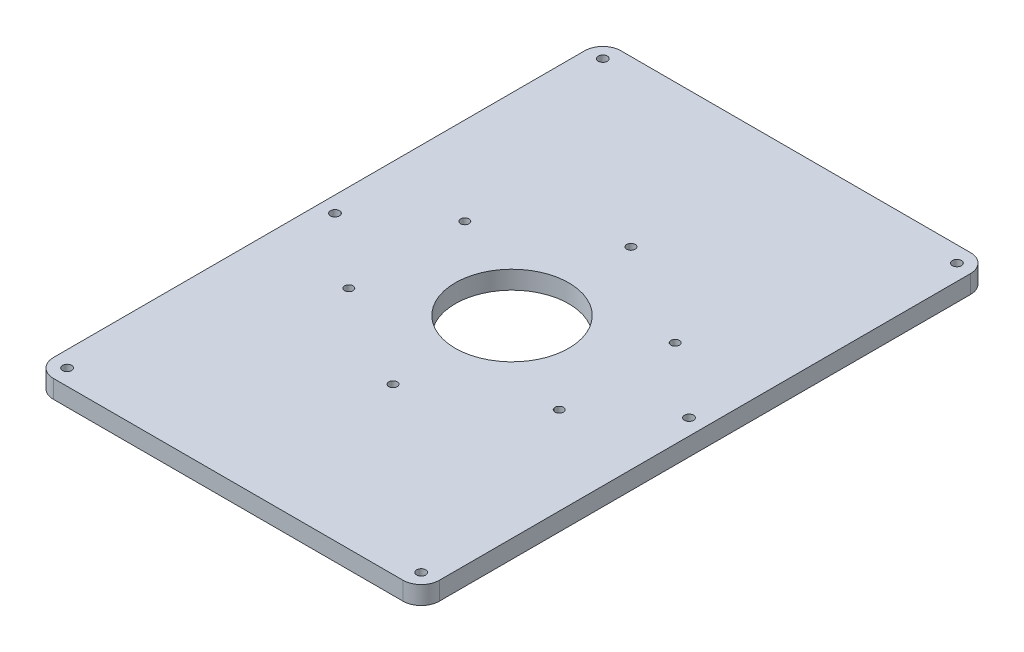
ISO-10303-21;
HEADER;
FILE_DESCRIPTION(('STEP AP214'),'2;1');
FILE_NAME('part.step','',(''),(''),'','','');
FILE_SCHEMA(('AUTOMOTIVE_DESIGN { 1 0 10303 214 1 1 1 1 }'));
ENDSEC;
DATA;
#1=APPLICATION_CONTEXT('core data for automotive mechanical design processes');
#2=APPLICATION_PROTOCOL_DEFINITION('international standard','automotive_design',2000,#1);
#3=PRODUCT_CONTEXT('',#1,'mechanical');
#4=PRODUCT('Part','Part','',(#3));
#5=PRODUCT_RELATED_PRODUCT_CATEGORY('part','',(#4));
#6=PRODUCT_DEFINITION_FORMATION('','',#4);
#7=PRODUCT_DEFINITION_CONTEXT('part definition',#1,'design');
#8=PRODUCT_DEFINITION('design','',#6,#7);
#9=PRODUCT_DEFINITION_SHAPE('','',#8);
#10=(LENGTH_UNIT() NAMED_UNIT(*) SI_UNIT(.MILLI.,.METRE.));
#11=(NAMED_UNIT(*) PLANE_ANGLE_UNIT() SI_UNIT($,.RADIAN.));
#12=(NAMED_UNIT(*) SI_UNIT($,.STERADIAN.) SOLID_ANGLE_UNIT());
#13=UNCERTAINTY_MEASURE_WITH_UNIT(LENGTH_MEASURE(1.E-05),#10,'distance_accuracy_value','');
#14=(GEOMETRIC_REPRESENTATION_CONTEXT(3) GLOBAL_UNCERTAINTY_ASSIGNED_CONTEXT((#13)) GLOBAL_UNIT_ASSIGNED_CONTEXT((#10,
#11,#12)) REPRESENTATION_CONTEXT('',''));
#15=CARTESIAN_POINT('',(0.,0.,0.));
#16=DIRECTION('',(0.,0.,1.));
#17=DIRECTION('',(1.,0.,0.));
#18=AXIS2_PLACEMENT_3D('',#15,#16,#17);
#19=CARTESIAN_POINT('',(84.9999999999999,8.,-125.));
#20=DIRECTION('',(-1.,0.,0.));
#21=DIRECTION('',(0.,0.,1.));
#22=AXIS2_PLACEMENT_3D('',#19,#20,#21);
#23=PLANE('',#22);
#24=DIRECTION('',(0.,0.,-1.));
#25=VECTOR('',#24,1.);
#26=CARTESIAN_POINT('',(84.9999999999999,8.,-125.));
#27=LINE('',#26,#25);
#28=CARTESIAN_POINT('',(85.,8.,117.));
#29=VERTEX_POINT('',#28);
#30=CARTESIAN_POINT('',(84.9999999999999,8.,-117.));
#31=VERTEX_POINT('',#30);
#32=EDGE_CURVE('E124',#29,#31,#27,.T.);
#33=ORIENTED_EDGE('',*,*,#32,.F.);
#34=DIRECTION('',(0.,-1.,0.));
#35=VECTOR('',#34,1.);
#36=CARTESIAN_POINT('',(85.,8.,117.));
#37=LINE('',#36,#35);
#38=CARTESIAN_POINT('',(85.,0.,117.));
#39=VERTEX_POINT('',#38);
#40=EDGE_CURVE('E109',#29,#39,#37,.T.);
#41=ORIENTED_EDGE('',*,*,#40,.T.);
#42=DIRECTION('',(0.,0.,-1.));
#43=VECTOR('',#42,1.);
#44=CARTESIAN_POINT('',(84.9999999999999,0.,-125.));
#45=LINE('',#44,#43);
#46=CARTESIAN_POINT('',(84.9999999999999,0.,-117.));
#47=VERTEX_POINT('',#46);
#48=EDGE_CURVE('E121',#39,#47,#45,.T.);
#49=ORIENTED_EDGE('',*,*,#48,.T.);
#50=DIRECTION('',(0.,-1.,0.));
#51=VECTOR('',#50,1.);
#52=CARTESIAN_POINT('',(84.9999999999999,8.,-117.));
#53=LINE('',#52,#51);
#54=EDGE_CURVE('E126',#47,#31,#53,.F.);
#55=ORIENTED_EDGE('',*,*,#54,.T.);
#56=EDGE_LOOP('',(#33,#41,#49,#55));
#57=FACE_BOUND('',#56,.T.);
#58=ADVANCED_FACE('F36',(#57),#23,.F.);
#59=CARTESIAN_POINT('',(-85.0000000000001,8.,-125.));
#60=DIRECTION('',(0.,0.,1.));
#61=DIRECTION('',(1.,0.,0.));
#62=AXIS2_PLACEMENT_3D('',#59,#60,#61);
#63=PLANE('',#62);
#64=DIRECTION('',(-1.,0.,0.));
#65=VECTOR('',#64,1.);
#66=CARTESIAN_POINT('',(-85.0000000000001,8.,-125.));
#67=LINE('',#66,#65);
#68=CARTESIAN_POINT('',(76.9999999999999,8.,-125.));
#69=VERTEX_POINT('',#68);
#70=CARTESIAN_POINT('',(-77.0000000000001,8.,-125.));
#71=VERTEX_POINT('',#70);
#72=EDGE_CURVE('E225',#69,#71,#67,.T.);
#73=ORIENTED_EDGE('',*,*,#72,.F.);
#74=DIRECTION('',(0.,-1.,0.));
#75=VECTOR('',#74,1.);
#76=CARTESIAN_POINT('',(76.9999999999999,8.,-125.));
#77=LINE('',#76,#75);
#78=CARTESIAN_POINT('',(76.9999999999999,0.,-125.));
#79=VERTEX_POINT('',#78);
#80=EDGE_CURVE('E11',#69,#79,#77,.T.);
#81=ORIENTED_EDGE('',*,*,#80,.T.);
#82=DIRECTION('',(-1.,0.,0.));
#83=VECTOR('',#82,1.);
#84=CARTESIAN_POINT('',(-85.0000000000001,0.,-125.));
#85=LINE('',#84,#83);
#86=CARTESIAN_POINT('',(-77.0000000000001,0.,-125.));
#87=VERTEX_POINT('',#86);
#88=EDGE_CURVE('E131',#79,#87,#85,.T.);
#89=ORIENTED_EDGE('',*,*,#88,.T.);
#90=DIRECTION('',(0.,-1.,0.));
#91=VECTOR('',#90,1.);
#92=CARTESIAN_POINT('',(-77.0000000000001,8.,-125.));
#93=LINE('',#92,#91);
#94=EDGE_CURVE('E45',#87,#71,#93,.F.);
#95=ORIENTED_EDGE('',*,*,#94,.T.);
#96=EDGE_LOOP('',(#73,#81,#89,#95));
#97=FACE_BOUND('',#96,.T.);
#98=ADVANCED_FACE('F243',(#97),#63,.F.);
#99=CARTESIAN_POINT('',(-85.0000000000001,8.,-125.));
#100=DIRECTION('',(1.,0.,0.));
#101=DIRECTION('',(0.,0.,-1.));
#102=AXIS2_PLACEMENT_3D('',#99,#100,#101);
#103=PLANE('',#102);
#104=DIRECTION('',(0.,0.,1.));
#105=VECTOR('',#104,1.);
#106=CARTESIAN_POINT('',(-85.0000000000001,0.,-125.));
#107=LINE('',#106,#105);
#108=CARTESIAN_POINT('',(-85.0000000000001,0.,-117.));
#109=VERTEX_POINT('',#108);
#110=CARTESIAN_POINT('',(-85.,0.,117.));
#111=VERTEX_POINT('',#110);
#112=EDGE_CURVE('E135',#109,#111,#107,.T.);
#113=ORIENTED_EDGE('',*,*,#112,.T.);
#114=DIRECTION('',(0.,-1.,0.));
#115=VECTOR('',#114,1.);
#116=CARTESIAN_POINT('',(-85.,8.,117.));
#117=LINE('',#116,#115);
#118=CARTESIAN_POINT('',(-85.,8.,117.));
#119=VERTEX_POINT('',#118);
#120=EDGE_CURVE('E53',#111,#119,#117,.F.);
#121=ORIENTED_EDGE('',*,*,#120,.T.);
#122=DIRECTION('',(0.,0.,1.));
#123=VECTOR('',#122,1.);
#124=CARTESIAN_POINT('',(-85.0000000000001,8.,-125.));
#125=LINE('',#124,#123);
#126=CARTESIAN_POINT('',(-85.0000000000001,8.,-117.));
#127=VERTEX_POINT('',#126);
#128=EDGE_CURVE('E226',#127,#119,#125,.T.);
#129=ORIENTED_EDGE('',*,*,#128,.F.);
#130=DIRECTION('',(0.,-1.,0.));
#131=VECTOR('',#130,1.);
#132=CARTESIAN_POINT('',(-85.0000000000001,8.,-117.));
#133=LINE('',#132,#131);
#134=EDGE_CURVE('E161',#127,#109,#133,.T.);
#135=ORIENTED_EDGE('',*,*,#134,.T.);
#136=EDGE_LOOP('',(#113,#121,#129,#135));
#137=FACE_BOUND('',#136,.T.);
#138=ADVANCED_FACE('F237',(#137),#103,.F.);
#139=CARTESIAN_POINT('',(-85.,8.,125.));
#140=DIRECTION('',(0.,0.,-1.));
#141=DIRECTION('',(-1.,0.,0.));
#142=AXIS2_PLACEMENT_3D('',#139,#140,#141);
#143=PLANE('',#142);
#144=DIRECTION('',(1.,0.,0.));
#145=VECTOR('',#144,1.);
#146=CARTESIAN_POINT('',(-85.,0.,125.));
#147=LINE('',#146,#145);
#148=CARTESIAN_POINT('',(-77.,0.,125.));
#149=VERTEX_POINT('',#148);
#150=CARTESIAN_POINT('',(77.,0.,125.));
#151=VERTEX_POINT('',#150);
#152=EDGE_CURVE('E145',#149,#151,#147,.T.);
#153=ORIENTED_EDGE('',*,*,#152,.T.);
#154=DIRECTION('',(0.,-1.,0.));
#155=VECTOR('',#154,1.);
#156=CARTESIAN_POINT('',(77.,8.,125.));
#157=LINE('',#156,#155);
#158=CARTESIAN_POINT('',(77.,8.,125.));
#159=VERTEX_POINT('',#158);
#160=EDGE_CURVE('E110',#151,#159,#157,.F.);
#161=ORIENTED_EDGE('',*,*,#160,.T.);
#162=DIRECTION('',(1.,0.,0.));
#163=VECTOR('',#162,1.);
#164=CARTESIAN_POINT('',(-85.,8.,125.));
#165=LINE('',#164,#163);
#166=CARTESIAN_POINT('',(-77.,8.,125.));
#167=VERTEX_POINT('',#166);
#168=EDGE_CURVE('E141',#167,#159,#165,.T.);
#169=ORIENTED_EDGE('',*,*,#168,.F.);
#170=DIRECTION('',(0.,-1.,0.));
#171=VECTOR('',#170,1.);
#172=CARTESIAN_POINT('',(-77.,8.,125.));
#173=LINE('',#172,#171);
#174=EDGE_CURVE('E115',#167,#149,#173,.T.);
#175=ORIENTED_EDGE('',*,*,#174,.T.);
#176=EDGE_LOOP('',(#153,#161,#169,#175));
#177=FACE_BOUND('',#176,.T.);
#178=ADVANCED_FACE('F233',(#177),#143,.F.);
#179=CARTESIAN_POINT('',(0.,8.,0.));
#180=DIRECTION('',(0.,1.,0.));
#181=DIRECTION('',(0.,0.,1.));
#182=AXIS2_PLACEMENT_3D('',#179,#180,#181);
#183=PLANE('',#182);
#184=CARTESIAN_POINT('',(46.3437274799606,8.,25.5405604649214));
#185=DIRECTION('',(0.,1.,0.));
#186=DIRECTION('',(0.,0.,1.));
#187=AXIS2_PLACEMENT_3D('',#184,#185,#186);
#188=CIRCLE('',#187,1.86601650584626);
#189=CARTESIAN_POINT('',(46.3437274799606,8.,27.4065769707677));
#190=VERTEX_POINT('',#189);
#191=EDGE_CURVE('E507',#190,#190,#188,.T.);
#192=ORIENTED_EDGE('',*,*,#191,.F.);
#193=EDGE_LOOP('',(#192));
#194=FACE_BOUND('',#193,.T.);
#195=CARTESIAN_POINT('',(46.3437274799606,8.,-25.5405604649214));
#196=DIRECTION('',(0.,1.,0.));
#197=DIRECTION('',(0.,0.,-1.));
#198=AXIS2_PLACEMENT_3D('',#195,#196,#197);
#199=CIRCLE('',#198,1.86601650584626);
#200=CARTESIAN_POINT('',(46.3437274799606,8.,-27.4065769707677));
#201=VERTEX_POINT('',#200);
#202=EDGE_CURVE('E508',#201,#201,#199,.T.);
#203=ORIENTED_EDGE('',*,*,#202,.F.);
#204=EDGE_LOOP('',(#203));
#205=FACE_BOUND('',#204,.T.);
#206=CARTESIAN_POINT('',(-46.3437274799606,8.,25.5405604649214));
#207=DIRECTION('',(0.,1.,0.));
#208=DIRECTION('',(0.,0.,-1.));
#209=AXIS2_PLACEMENT_3D('',#206,#207,#208);
#210=CIRCLE('',#209,1.86601650584626);
#211=CARTESIAN_POINT('',(-46.3437274799606,8.,23.6745439590752));
#212=VERTEX_POINT('',#211);
#213=EDGE_CURVE('E511',#212,#212,#210,.T.);
#214=ORIENTED_EDGE('',*,*,#213,.F.);
#215=EDGE_LOOP('',(#214));
#216=FACE_BOUND('',#215,.T.);
#217=CARTESIAN_POINT('',(0.,8.,52.4128369823515));
#218=DIRECTION('',(0.,1.,0.));
#219=DIRECTION('',(0.,0.,-1.));
#220=AXIS2_PLACEMENT_3D('',#217,#218,#219);
#221=CIRCLE('',#220,1.86601650584626);
#222=CARTESIAN_POINT('',(0.,8.,50.5468204765052));
#223=VERTEX_POINT('',#222);
#224=EDGE_CURVE('E522',#223,#223,#221,.T.);
#225=ORIENTED_EDGE('',*,*,#224,.F.);
#226=EDGE_LOOP('',(#225));
#227=FACE_BOUND('',#226,.T.);
#228=CARTESIAN_POINT('',(-46.3437274799606,8.,-25.5405604649214));
#229=DIRECTION('',(0.,1.,0.));
#230=DIRECTION('',(0.,0.,1.));
#231=AXIS2_PLACEMENT_3D('',#228,#229,#230);
#232=CIRCLE('',#231,1.86601650584626);
#233=CARTESIAN_POINT('',(-46.3437274799606,8.,-23.6745439590752));
#234=VERTEX_POINT('',#233);
#235=EDGE_CURVE('E518',#234,#234,#232,.T.);
#236=ORIENTED_EDGE('',*,*,#235,.F.);
#237=EDGE_LOOP('',(#236));
#238=FACE_BOUND('',#237,.T.);
#239=CARTESIAN_POINT('',(0.,8.,-52.4128369823515));
#240=DIRECTION('',(0.,1.,0.));
#241=DIRECTION('',(0.,0.,1.));
#242=AXIS2_PLACEMENT_3D('',#239,#240,#241);
#243=CIRCLE('',#242,1.86601650584626);
#244=CARTESIAN_POINT('',(0.,8.,-50.5468204765052));
#245=VERTEX_POINT('',#244);
#246=EDGE_CURVE('E515',#245,#245,#243,.T.);
#247=ORIENTED_EDGE('',*,*,#246,.F.);
#248=EDGE_LOOP('',(#247));
#249=FACE_BOUND('',#248,.T.);
#250=CARTESIAN_POINT('',(0.,8.,0.));
#251=DIRECTION('',(0.,1.,0.));
#252=DIRECTION('',(0.,0.,1.));
#253=AXIS2_PLACEMENT_3D('',#250,#251,#252);
#254=CIRCLE('',#253,25.);
#255=CARTESIAN_POINT('',(0.,8.,25.));
#256=VERTEX_POINT('',#255);
#257=EDGE_CURVE('E170',#256,#256,#254,.T.);
#258=ORIENTED_EDGE('',*,*,#257,.F.);
#259=EDGE_LOOP('',(#258));
#260=FACE_BOUND('',#259,.T.);
#261=CARTESIAN_POINT('',(77.9999999999992,8.,-118.000000000001));
#262=DIRECTION('',(0.,1.,0.));
#263=DIRECTION('',(0.,0.,-1.));
#264=AXIS2_PLACEMENT_3D('',#261,#262,#263);
#265=CIRCLE('',#264,2.00000000000001);
#266=CARTESIAN_POINT('',(77.9999999999992,8.,-120.000000000001));
#267=VERTEX_POINT('',#266);
#268=EDGE_CURVE('E199',#267,#267,#265,.T.);
#269=ORIENTED_EDGE('',*,*,#268,.F.);
#270=EDGE_LOOP('',(#269));
#271=FACE_BOUND('',#270,.T.);
#272=CARTESIAN_POINT('',(77.9999999999992,8.,118.000000000001));
#273=DIRECTION('',(0.,1.,0.));
#274=DIRECTION('',(0.,0.,1.));
#275=AXIS2_PLACEMENT_3D('',#272,#273,#274);
#276=CIRCLE('',#275,2.00000000000001);
#277=CARTESIAN_POINT('',(77.9999999999992,8.,120.000000000001));
#278=VERTEX_POINT('',#277);
#279=EDGE_CURVE('E205',#278,#278,#276,.T.);
#280=ORIENTED_EDGE('',*,*,#279,.F.);
#281=EDGE_LOOP('',(#280));
#282=FACE_BOUND('',#281,.T.);
#283=CARTESIAN_POINT('',(-78.0000000000001,8.,118.));
#284=DIRECTION('',(0.,1.,0.));
#285=DIRECTION('',(0.,0.,-1.));
#286=AXIS2_PLACEMENT_3D('',#283,#284,#285);
#287=CIRCLE('',#286,2.);
#288=CARTESIAN_POINT('',(-78.0000000000001,8.,116.));
#289=VERTEX_POINT('',#288);
#290=EDGE_CURVE('E211',#289,#289,#287,.T.);
#291=ORIENTED_EDGE('',*,*,#290,.F.);
#292=EDGE_LOOP('',(#291));
#293=FACE_BOUND('',#292,.T.);
#294=CARTESIAN_POINT('',(-78.0000000000004,8.,0.));
#295=DIRECTION('',(0.,1.,0.));
#296=DIRECTION('',(0.,0.,1.));
#297=AXIS2_PLACEMENT_3D('',#294,#295,#296);
#298=CIRCLE('',#297,2.);
#299=CARTESIAN_POINT('',(-78.0000000000004,8.,2.));
#300=VERTEX_POINT('',#299);
#301=EDGE_CURVE('E217',#300,#300,#298,.T.);
#302=ORIENTED_EDGE('',*,*,#301,.F.);
#303=EDGE_LOOP('',(#302));
#304=FACE_BOUND('',#303,.T.);
#305=CARTESIAN_POINT('',(78.0000000000004,8.,-5.41233724504764E-13));
#306=DIRECTION('',(0.,1.,0.));
#307=DIRECTION('',(0.,0.,-1.));
#308=AXIS2_PLACEMENT_3D('',#305,#306,#307);
#309=CIRCLE('',#308,1.99999999999999);
#310=CARTESIAN_POINT('',(78.0000000000004,8.,-2.00000000000053));
#311=VERTEX_POINT('',#310);
#312=EDGE_CURVE('E190',#311,#311,#309,.T.);
#313=ORIENTED_EDGE('',*,*,#312,.F.);
#314=EDGE_LOOP('',(#313));
#315=FACE_BOUND('',#314,.T.);
#316=CARTESIAN_POINT('',(-78.0000000000001,8.,-118.));
#317=DIRECTION('',(0.,1.,0.));
#318=DIRECTION('',(0.,0.,1.));
#319=AXIS2_PLACEMENT_3D('',#316,#317,#318);
#320=CIRCLE('',#319,2.);
#321=CARTESIAN_POINT('',(-78.0000000000001,8.,-116.));
#322=VERTEX_POINT('',#321);
#323=EDGE_CURVE('E138',#322,#322,#320,.T.);
#324=ORIENTED_EDGE('',*,*,#323,.F.);
#325=EDGE_LOOP('',(#324));
#326=FACE_BOUND('',#325,.T.);
#327=ORIENTED_EDGE('',*,*,#168,.T.);
#328=CARTESIAN_POINT('',(77.,8.,117.));
#329=DIRECTION('',(0.,1.,0.));
#330=DIRECTION('',(0.,0.,1.));
#331=AXIS2_PLACEMENT_3D('',#328,#329,#330);
#332=CIRCLE('',#331,8.);
#333=EDGE_CURVE('E159',#159,#29,#332,.T.);
#334=ORIENTED_EDGE('',*,*,#333,.T.);
#335=ORIENTED_EDGE('',*,*,#32,.T.);
#336=CARTESIAN_POINT('',(76.9999999999999,8.,-117.));
#337=DIRECTION('',(0.,1.,0.));
#338=DIRECTION('',(0.,0.,1.));
#339=AXIS2_PLACEMENT_3D('',#336,#337,#338);
#340=CIRCLE('',#339,8.);
#341=EDGE_CURVE('E155',#31,#69,#340,.T.);
#342=ORIENTED_EDGE('',*,*,#341,.T.);
#343=ORIENTED_EDGE('',*,*,#72,.T.);
#344=CARTESIAN_POINT('',(-77.0000000000001,8.,-117.));
#345=DIRECTION('',(0.,1.,0.));
#346=DIRECTION('',(0.,0.,1.));
#347=AXIS2_PLACEMENT_3D('',#344,#345,#346);
#348=CIRCLE('',#347,8.);
#349=EDGE_CURVE('E60',#71,#127,#348,.T.);
#350=ORIENTED_EDGE('',*,*,#349,.T.);
#351=ORIENTED_EDGE('',*,*,#128,.T.);
#352=CARTESIAN_POINT('',(-77.,8.,117.));
#353=DIRECTION('',(0.,1.,0.));
#354=DIRECTION('',(0.,0.,1.));
#355=AXIS2_PLACEMENT_3D('',#352,#353,#354);
#356=CIRCLE('',#355,8.);
#357=EDGE_CURVE('E157',#119,#167,#356,.T.);
#358=ORIENTED_EDGE('',*,*,#357,.T.);
#359=EDGE_LOOP('',(#327,#334,#335,#342,#343,#350,#351,#358));
#360=FACE_BOUND('',#359,.T.);
#361=ADVANCED_FACE('F230',(#194,#205,#216,#227,#238,#249,#260,#271,#282,#293,#304,#315,#326,
#360),#183,.T.);
#362=CARTESIAN_POINT('',(0.,0.,0.));
#363=DIRECTION('',(0.,1.,0.));
#364=DIRECTION('',(0.,0.,1.));
#365=AXIS2_PLACEMENT_3D('',#362,#363,#364);
#366=PLANE('',#365);
#367=CARTESIAN_POINT('',(46.3437274799606,0.,25.5405604649214));
#368=DIRECTION('',(0.,1.,0.));
#369=DIRECTION('',(0.,0.,1.));
#370=AXIS2_PLACEMENT_3D('',#367,#368,#369);
#371=CIRCLE('',#370,1.86601650584626);
#372=CARTESIAN_POINT('',(46.3437274799606,0.,27.4065769707677));
#373=VERTEX_POINT('',#372);
#374=EDGE_CURVE('E40',#373,#373,#371,.T.);
#375=ORIENTED_EDGE('',*,*,#374,.T.);
#376=EDGE_LOOP('',(#375));
#377=FACE_BOUND('',#376,.T.);
#378=CARTESIAN_POINT('',(46.3437274799606,0.,-25.5405604649214));
#379=DIRECTION('',(0.,1.,0.));
#380=DIRECTION('',(0.,0.,1.));
#381=AXIS2_PLACEMENT_3D('',#378,#379,#380);
#382=CIRCLE('',#381,1.86601650584626);
#383=CARTESIAN_POINT('',(46.3437274799606,0.,-23.6745439590752));
#384=VERTEX_POINT('',#383);
#385=EDGE_CURVE('E181',#384,#384,#382,.T.);
#386=ORIENTED_EDGE('',*,*,#385,.T.);
#387=EDGE_LOOP('',(#386));
#388=FACE_BOUND('',#387,.T.);
#389=CARTESIAN_POINT('',(-46.3437274799606,0.,25.5405604649214));
#390=DIRECTION('',(0.,1.,0.));
#391=DIRECTION('',(0.,0.,1.));
#392=AXIS2_PLACEMENT_3D('',#389,#390,#391);
#393=CIRCLE('',#392,1.86601650584626);
#394=CARTESIAN_POINT('',(-46.3437274799606,0.,27.4065769707677));
#395=VERTEX_POINT('',#394);
#396=EDGE_CURVE('E179',#395,#395,#393,.T.);
#397=ORIENTED_EDGE('',*,*,#396,.T.);
#398=EDGE_LOOP('',(#397));
#399=FACE_BOUND('',#398,.T.);
#400=CARTESIAN_POINT('',(0.,0.,52.4128369823515));
#401=DIRECTION('',(0.,1.,0.));
#402=DIRECTION('',(0.,0.,1.));
#403=AXIS2_PLACEMENT_3D('',#400,#401,#402);
#404=CIRCLE('',#403,1.86601650584626);
#405=CARTESIAN_POINT('',(0.,0.,54.2788534881978));
#406=VERTEX_POINT('',#405);
#407=EDGE_CURVE('E176',#406,#406,#404,.T.);
#408=ORIENTED_EDGE('',*,*,#407,.T.);
#409=EDGE_LOOP('',(#408));
#410=FACE_BOUND('',#409,.T.);
#411=CARTESIAN_POINT('',(-46.3437274799606,0.,-25.5405604649214));
#412=DIRECTION('',(0.,1.,0.));
#413=DIRECTION('',(0.,0.,1.));
#414=AXIS2_PLACEMENT_3D('',#411,#412,#413);
#415=CIRCLE('',#414,1.86601650584626);
#416=CARTESIAN_POINT('',(-46.3437274799606,0.,-23.6745439590752));
#417=VERTEX_POINT('',#416);
#418=EDGE_CURVE('E173',#417,#417,#415,.T.);
#419=ORIENTED_EDGE('',*,*,#418,.T.);
#420=EDGE_LOOP('',(#419));
#421=FACE_BOUND('',#420,.T.);
#422=CARTESIAN_POINT('',(0.,0.,-52.4128369823515));
#423=DIRECTION('',(0.,1.,0.));
#424=DIRECTION('',(0.,0.,1.));
#425=AXIS2_PLACEMENT_3D('',#422,#423,#424);
#426=CIRCLE('',#425,1.86601650584626);
#427=CARTESIAN_POINT('',(0.,0.,-50.5468204765052));
#428=VERTEX_POINT('',#427);
#429=EDGE_CURVE('E169',#428,#428,#426,.T.);
#430=ORIENTED_EDGE('',*,*,#429,.T.);
#431=EDGE_LOOP('',(#430));
#432=FACE_BOUND('',#431,.T.);
#433=CARTESIAN_POINT('',(0.,0.,0.));
#434=DIRECTION('',(0.,1.,0.));
#435=DIRECTION('',(0.,0.,1.));
#436=AXIS2_PLACEMENT_3D('',#433,#434,#435);
#437=CIRCLE('',#436,25.);
#438=CARTESIAN_POINT('',(0.,0.,25.));
#439=VERTEX_POINT('',#438);
#440=EDGE_CURVE('E166',#439,#439,#437,.T.);
#441=ORIENTED_EDGE('',*,*,#440,.T.);
#442=EDGE_LOOP('',(#441));
#443=FACE_BOUND('',#442,.T.);
#444=CARTESIAN_POINT('',(77.9999999999992,0.,-118.000000000001));
#445=DIRECTION('',(0.,1.,0.));
#446=DIRECTION('',(0.,0.,-1.));
#447=AXIS2_PLACEMENT_3D('',#444,#445,#446);
#448=CIRCLE('',#447,2.00000000000001);
#449=CARTESIAN_POINT('',(77.9999999999992,0.,-120.000000000001));
#450=VERTEX_POINT('',#449);
#451=EDGE_CURVE('E202',#450,#450,#448,.T.);
#452=ORIENTED_EDGE('',*,*,#451,.T.);
#453=EDGE_LOOP('',(#452));
#454=FACE_BOUND('',#453,.T.);
#455=CARTESIAN_POINT('',(77.9999999999992,0.,118.000000000001));
#456=DIRECTION('',(0.,1.,0.));
#457=DIRECTION('',(0.,0.,1.));
#458=AXIS2_PLACEMENT_3D('',#455,#456,#457);
#459=CIRCLE('',#458,2.00000000000001);
#460=CARTESIAN_POINT('',(77.9999999999992,0.,120.000000000001));
#461=VERTEX_POINT('',#460);
#462=EDGE_CURVE('E208',#461,#461,#459,.T.);
#463=ORIENTED_EDGE('',*,*,#462,.T.);
#464=EDGE_LOOP('',(#463));
#465=FACE_BOUND('',#464,.T.);
#466=CARTESIAN_POINT('',(-78.0000000000001,0.,118.));
#467=DIRECTION('',(0.,1.,0.));
#468=DIRECTION('',(0.,0.,-1.));
#469=AXIS2_PLACEMENT_3D('',#466,#467,#468);
#470=CIRCLE('',#469,2.);
#471=CARTESIAN_POINT('',(-78.0000000000001,0.,116.));
#472=VERTEX_POINT('',#471);
#473=EDGE_CURVE('E214',#472,#472,#470,.T.);
#474=ORIENTED_EDGE('',*,*,#473,.T.);
#475=EDGE_LOOP('',(#474));
#476=FACE_BOUND('',#475,.T.);
#477=CARTESIAN_POINT('',(-78.0000000000004,0.,0.));
#478=DIRECTION('',(0.,1.,0.));
#479=DIRECTION('',(0.,0.,1.));
#480=AXIS2_PLACEMENT_3D('',#477,#478,#479);
#481=CIRCLE('',#480,2.);
#482=CARTESIAN_POINT('',(-78.0000000000004,0.,2.));
#483=VERTEX_POINT('',#482);
#484=EDGE_CURVE('E195',#483,#483,#481,.T.);
#485=ORIENTED_EDGE('',*,*,#484,.T.);
#486=EDGE_LOOP('',(#485));
#487=FACE_BOUND('',#486,.T.);
#488=CARTESIAN_POINT('',(78.0000000000004,0.,-5.41233724504764E-13));
#489=DIRECTION('',(0.,1.,0.));
#490=DIRECTION('',(0.,0.,-1.));
#491=AXIS2_PLACEMENT_3D('',#488,#489,#490);
#492=CIRCLE('',#491,1.99999999999999);
#493=CARTESIAN_POINT('',(78.0000000000004,0.,-2.00000000000053));
#494=VERTEX_POINT('',#493);
#495=EDGE_CURVE('E186',#494,#494,#492,.T.);
#496=ORIENTED_EDGE('',*,*,#495,.T.);
#497=EDGE_LOOP('',(#496));
#498=FACE_BOUND('',#497,.T.);
#499=CARTESIAN_POINT('',(-78.0000000000001,0.,-118.));
#500=DIRECTION('',(0.,1.,0.));
#501=DIRECTION('',(0.,0.,1.));
#502=AXIS2_PLACEMENT_3D('',#499,#500,#501);
#503=CIRCLE('',#502,2.);
#504=CARTESIAN_POINT('',(-78.0000000000001,0.,-116.));
#505=VERTEX_POINT('',#504);
#506=EDGE_CURVE('E132',#505,#505,#503,.T.);
#507=ORIENTED_EDGE('',*,*,#506,.T.);
#508=EDGE_LOOP('',(#507));
#509=FACE_BOUND('',#508,.T.);
#510=ORIENTED_EDGE('',*,*,#48,.F.);
#511=CARTESIAN_POINT('',(77.,0.,117.));
#512=DIRECTION('',(0.,1.,0.));
#513=DIRECTION('',(0.,0.,1.));
#514=AXIS2_PLACEMENT_3D('',#511,#512,#513);
#515=CIRCLE('',#514,8.);
#516=EDGE_CURVE('E105',#39,#151,#515,.F.);
#517=ORIENTED_EDGE('',*,*,#516,.T.);
#518=ORIENTED_EDGE('',*,*,#152,.F.);
#519=CARTESIAN_POINT('',(-77.,0.,117.));
#520=DIRECTION('',(0.,1.,0.));
#521=DIRECTION('',(0.,0.,1.));
#522=AXIS2_PLACEMENT_3D('',#519,#520,#521);
#523=CIRCLE('',#522,8.);
#524=EDGE_CURVE('E116',#149,#111,#523,.F.);
#525=ORIENTED_EDGE('',*,*,#524,.T.);
#526=ORIENTED_EDGE('',*,*,#112,.F.);
#527=CARTESIAN_POINT('',(-77.0000000000001,0.,-117.));
#528=DIRECTION('',(0.,1.,0.));
#529=DIRECTION('',(0.,0.,1.));
#530=AXIS2_PLACEMENT_3D('',#527,#528,#529);
#531=CIRCLE('',#530,8.);
#532=EDGE_CURVE('E125',#109,#87,#531,.F.);
#533=ORIENTED_EDGE('',*,*,#532,.T.);
#534=ORIENTED_EDGE('',*,*,#88,.F.);
#535=CARTESIAN_POINT('',(76.9999999999999,0.,-117.));
#536=DIRECTION('',(0.,1.,0.));
#537=DIRECTION('',(0.,0.,1.));
#538=AXIS2_PLACEMENT_3D('',#535,#536,#537);
#539=CIRCLE('',#538,8.);
#540=EDGE_CURVE('E130',#79,#47,#539,.F.);
#541=ORIENTED_EDGE('',*,*,#540,.T.);
#542=EDGE_LOOP('',(#510,#517,#518,#525,#526,#533,#534,#541));
#543=FACE_BOUND('',#542,.T.);
#544=ADVANCED_FACE('F128',(#377,#388,#399,#410,#421,#432,#443,#454,#465,#476,#487,#498,#509,
#543),#366,.F.);
#545=CARTESIAN_POINT('',(-78.0000000000001,0.,-118.));
#546=DIRECTION('',(0.,1.,0.));
#547=DIRECTION('',(0.,0.,1.));
#548=AXIS2_PLACEMENT_3D('',#545,#546,#547);
#549=CYLINDRICAL_SURFACE('',#548,2.);
#550=ORIENTED_EDGE('',*,*,#506,.F.);
#551=EDGE_LOOP('',(#550));
#552=FACE_BOUND('',#551,.T.);
#553=ORIENTED_EDGE('',*,*,#323,.T.);
#554=EDGE_LOOP('',(#553));
#555=FACE_BOUND('',#554,.T.);
#556=ADVANCED_FACE('F290',(#552,#555),#549,.F.);
#557=CARTESIAN_POINT('',(78.0000000000004,0.,-5.41233724504764E-13));
#558=DIRECTION('',(0.,1.,0.));
#559=DIRECTION('',(0.,0.,1.));
#560=AXIS2_PLACEMENT_3D('',#557,#558,#559);
#561=CYLINDRICAL_SURFACE('',#560,1.99999999999999);
#562=ORIENTED_EDGE('',*,*,#495,.F.);
#563=EDGE_LOOP('',(#562));
#564=FACE_BOUND('',#563,.T.);
#565=ORIENTED_EDGE('',*,*,#312,.T.);
#566=EDGE_LOOP('',(#565));
#567=FACE_BOUND('',#566,.T.);
#568=ADVANCED_FACE('F280',(#564,#567),#561,.F.);
#569=CARTESIAN_POINT('',(-78.0000000000004,0.,0.));
#570=DIRECTION('',(0.,1.,0.));
#571=DIRECTION('',(0.,0.,1.));
#572=AXIS2_PLACEMENT_3D('',#569,#570,#571);
#573=CYLINDRICAL_SURFACE('',#572,2.);
#574=ORIENTED_EDGE('',*,*,#484,.F.);
#575=EDGE_LOOP('',(#574));
#576=FACE_BOUND('',#575,.T.);
#577=ORIENTED_EDGE('',*,*,#301,.T.);
#578=EDGE_LOOP('',(#577));
#579=FACE_BOUND('',#578,.T.);
#580=ADVANCED_FACE('F285',(#576,#579),#573,.F.);
#581=CARTESIAN_POINT('',(-78.0000000000001,0.,118.));
#582=DIRECTION('',(0.,1.,0.));
#583=DIRECTION('',(0.,0.,1.));
#584=AXIS2_PLACEMENT_3D('',#581,#582,#583);
#585=CYLINDRICAL_SURFACE('',#584,2.);
#586=ORIENTED_EDGE('',*,*,#473,.F.);
#587=EDGE_LOOP('',(#586));
#588=FACE_BOUND('',#587,.T.);
#589=ORIENTED_EDGE('',*,*,#290,.T.);
#590=EDGE_LOOP('',(#589));
#591=FACE_BOUND('',#590,.T.);
#592=ADVANCED_FACE('F274',(#588,#591),#585,.F.);
#593=CARTESIAN_POINT('',(77.9999999999992,0.,118.000000000001));
#594=DIRECTION('',(0.,1.,0.));
#595=DIRECTION('',(0.,0.,1.));
#596=AXIS2_PLACEMENT_3D('',#593,#594,#595);
#597=CYLINDRICAL_SURFACE('',#596,2.00000000000001);
#598=ORIENTED_EDGE('',*,*,#462,.F.);
#599=EDGE_LOOP('',(#598));
#600=FACE_BOUND('',#599,.T.);
#601=ORIENTED_EDGE('',*,*,#279,.T.);
#602=EDGE_LOOP('',(#601));
#603=FACE_BOUND('',#602,.T.);
#604=ADVANCED_FACE('F268',(#600,#603),#597,.F.);
#605=CARTESIAN_POINT('',(77.9999999999992,0.,-118.000000000001));
#606=DIRECTION('',(0.,1.,0.));
#607=DIRECTION('',(0.,0.,1.));
#608=AXIS2_PLACEMENT_3D('',#605,#606,#607);
#609=CYLINDRICAL_SURFACE('',#608,2.00000000000001);
#610=ORIENTED_EDGE('',*,*,#451,.F.);
#611=EDGE_LOOP('',(#610));
#612=FACE_BOUND('',#611,.T.);
#613=ORIENTED_EDGE('',*,*,#268,.T.);
#614=EDGE_LOOP('',(#613));
#615=FACE_BOUND('',#614,.T.);
#616=ADVANCED_FACE('F264',(#612,#615),#609,.F.);
#617=CARTESIAN_POINT('',(77.,8.,117.));
#618=DIRECTION('',(0.,-1.,0.));
#619=DIRECTION('',(0.,0.,-1.));
#620=AXIS2_PLACEMENT_3D('',#617,#618,#619);
#621=CYLINDRICAL_SURFACE('',#620,8.);
#622=ORIENTED_EDGE('',*,*,#333,.F.);
#623=ORIENTED_EDGE('',*,*,#160,.F.);
#624=ORIENTED_EDGE('',*,*,#516,.F.);
#625=ORIENTED_EDGE('',*,*,#40,.F.);
#626=EDGE_LOOP('',(#622,#623,#624,#625));
#627=FACE_BOUND('',#626,.T.);
#628=ADVANCED_FACE('F108',(#627),#621,.T.);
#629=CARTESIAN_POINT('',(-77.,8.,117.));
#630=DIRECTION('',(0.,-1.,0.));
#631=DIRECTION('',(0.,0.,-1.));
#632=AXIS2_PLACEMENT_3D('',#629,#630,#631);
#633=CYLINDRICAL_SURFACE('',#632,8.);
#634=ORIENTED_EDGE('',*,*,#357,.F.);
#635=ORIENTED_EDGE('',*,*,#120,.F.);
#636=ORIENTED_EDGE('',*,*,#524,.F.);
#637=ORIENTED_EDGE('',*,*,#174,.F.);
#638=EDGE_LOOP('',(#634,#635,#636,#637));
#639=FACE_BOUND('',#638,.T.);
#640=ADVANCED_FACE('F235',(#639),#633,.T.);
#641=CARTESIAN_POINT('',(76.9999999999999,8.,-117.));
#642=DIRECTION('',(0.,-1.,0.));
#643=DIRECTION('',(0.,0.,-1.));
#644=AXIS2_PLACEMENT_3D('',#641,#642,#643);
#645=CYLINDRICAL_SURFACE('',#644,8.);
#646=ORIENTED_EDGE('',*,*,#341,.F.);
#647=ORIENTED_EDGE('',*,*,#54,.F.);
#648=ORIENTED_EDGE('',*,*,#540,.F.);
#649=ORIENTED_EDGE('',*,*,#80,.F.);
#650=EDGE_LOOP('',(#646,#647,#648,#649));
#651=FACE_BOUND('',#650,.T.);
#652=ADVANCED_FACE('F247',(#651),#645,.T.);
#653=CARTESIAN_POINT('',(-77.0000000000001,8.,-117.));
#654=DIRECTION('',(0.,-1.,0.));
#655=DIRECTION('',(0.,0.,-1.));
#656=AXIS2_PLACEMENT_3D('',#653,#654,#655);
#657=CYLINDRICAL_SURFACE('',#656,8.);
#658=ORIENTED_EDGE('',*,*,#349,.F.);
#659=ORIENTED_EDGE('',*,*,#94,.F.);
#660=ORIENTED_EDGE('',*,*,#532,.F.);
#661=ORIENTED_EDGE('',*,*,#134,.F.);
#662=EDGE_LOOP('',(#658,#659,#660,#661));
#663=FACE_BOUND('',#662,.T.);
#664=ADVANCED_FACE('F38',(#663),#657,.T.);
#665=CARTESIAN_POINT('',(0.,-2.,0.));
#666=DIRECTION('',(0.,1.,0.));
#667=DIRECTION('',(0.,0.,1.));
#668=AXIS2_PLACEMENT_3D('',#665,#666,#667);
#669=CYLINDRICAL_SURFACE('',#668,25.);
#670=ORIENTED_EDGE('',*,*,#257,.T.);
#671=EDGE_LOOP('',(#670));
#672=FACE_BOUND('',#671,.T.);
#673=ORIENTED_EDGE('',*,*,#440,.F.);
#674=EDGE_LOOP('',(#673));
#675=FACE_BOUND('',#674,.T.);
#676=ADVANCED_FACE('F253',(#672,#675),#669,.F.);
#677=CARTESIAN_POINT('',(0.,-2.,-52.4128369823515));
#678=DIRECTION('',(0.,1.,0.));
#679=DIRECTION('',(0.,0.,1.));
#680=AXIS2_PLACEMENT_3D('',#677,#678,#679);
#681=CYLINDRICAL_SURFACE('',#680,1.86601650584626);
#682=ORIENTED_EDGE('',*,*,#246,.T.);
#683=EDGE_LOOP('',(#682));
#684=FACE_BOUND('',#683,.T.);
#685=ORIENTED_EDGE('',*,*,#429,.F.);
#686=EDGE_LOOP('',(#685));
#687=FACE_BOUND('',#686,.T.);
#688=ADVANCED_FACE('F422',(#684,#687),#681,.F.);
#689=CARTESIAN_POINT('',(-46.3437274799606,-2.,-25.5405604649214));
#690=DIRECTION('',(0.,1.,0.));
#691=DIRECTION('',(0.,0.,1.));
#692=AXIS2_PLACEMENT_3D('',#689,#690,#691);
#693=CYLINDRICAL_SURFACE('',#692,1.86601650584626);
#694=ORIENTED_EDGE('',*,*,#235,.T.);
#695=EDGE_LOOP('',(#694));
#696=FACE_BOUND('',#695,.T.);
#697=ORIENTED_EDGE('',*,*,#418,.F.);
#698=EDGE_LOOP('',(#697));
#699=FACE_BOUND('',#698,.T.);
#700=ADVANCED_FACE('F430',(#696,#699),#693,.F.);
#701=CARTESIAN_POINT('',(0.,-2.,52.4128369823515));
#702=DIRECTION('',(0.,1.,0.));
#703=DIRECTION('',(0.,0.,1.));
#704=AXIS2_PLACEMENT_3D('',#701,#702,#703);
#705=CYLINDRICAL_SURFACE('',#704,1.86601650584626);
#706=ORIENTED_EDGE('',*,*,#224,.T.);
#707=EDGE_LOOP('',(#706));
#708=FACE_BOUND('',#707,.T.);
#709=ORIENTED_EDGE('',*,*,#407,.F.);
#710=EDGE_LOOP('',(#709));
#711=FACE_BOUND('',#710,.T.);
#712=ADVANCED_FACE('F440',(#708,#711),#705,.F.);
#713=CARTESIAN_POINT('',(-46.3437274799606,-2.,25.5405604649214));
#714=DIRECTION('',(0.,1.,0.));
#715=DIRECTION('',(0.,0.,1.));
#716=AXIS2_PLACEMENT_3D('',#713,#714,#715);
#717=CYLINDRICAL_SURFACE('',#716,1.86601650584626);
#718=ORIENTED_EDGE('',*,*,#213,.T.);
#719=EDGE_LOOP('',(#718));
#720=FACE_BOUND('',#719,.T.);
#721=ORIENTED_EDGE('',*,*,#396,.F.);
#722=EDGE_LOOP('',(#721));
#723=FACE_BOUND('',#722,.T.);
#724=ADVANCED_FACE('F450',(#720,#723),#717,.F.);
#725=CARTESIAN_POINT('',(46.3437274799606,-2.,-25.5405604649214));
#726=DIRECTION('',(0.,1.,0.));
#727=DIRECTION('',(0.,0.,1.));
#728=AXIS2_PLACEMENT_3D('',#725,#726,#727);
#729=CYLINDRICAL_SURFACE('',#728,1.86601650584626);
#730=ORIENTED_EDGE('',*,*,#202,.T.);
#731=EDGE_LOOP('',(#730));
#732=FACE_BOUND('',#731,.T.);
#733=ORIENTED_EDGE('',*,*,#385,.F.);
#734=EDGE_LOOP('',(#733));
#735=FACE_BOUND('',#734,.T.);
#736=ADVANCED_FACE('F460',(#732,#735),#729,.F.);
#737=CARTESIAN_POINT('',(46.3437274799606,-2.,25.5405604649214));
#738=DIRECTION('',(0.,1.,0.));
#739=DIRECTION('',(0.,0.,1.));
#740=AXIS2_PLACEMENT_3D('',#737,#738,#739);
#741=CYLINDRICAL_SURFACE('',#740,1.86601650584626);
#742=ORIENTED_EDGE('',*,*,#191,.T.);
#743=EDGE_LOOP('',(#742));
#744=FACE_BOUND('',#743,.T.);
#745=ORIENTED_EDGE('',*,*,#374,.F.);
#746=EDGE_LOOP('',(#745));
#747=FACE_BOUND('',#746,.T.);
#748=ADVANCED_FACE('F470',(#744,#747),#741,.F.);
#749=CLOSED_SHELL('',(#58,#98,#138,#178,#361,#544,#556,#568,#580,#592,#604,#616,#628,#640,#652,
#664,#676,#688,#700,#712,#724,#736,#748));
#750=MANIFOLD_SOLID_BREP('B2',#749);
#751=ADVANCED_BREP_SHAPE_REPRESENTATION('',(#18,#750),#14);
#752=SHAPE_DEFINITION_REPRESENTATION(#9,#751);
ENDSEC;
END-ISO-10303-21;
